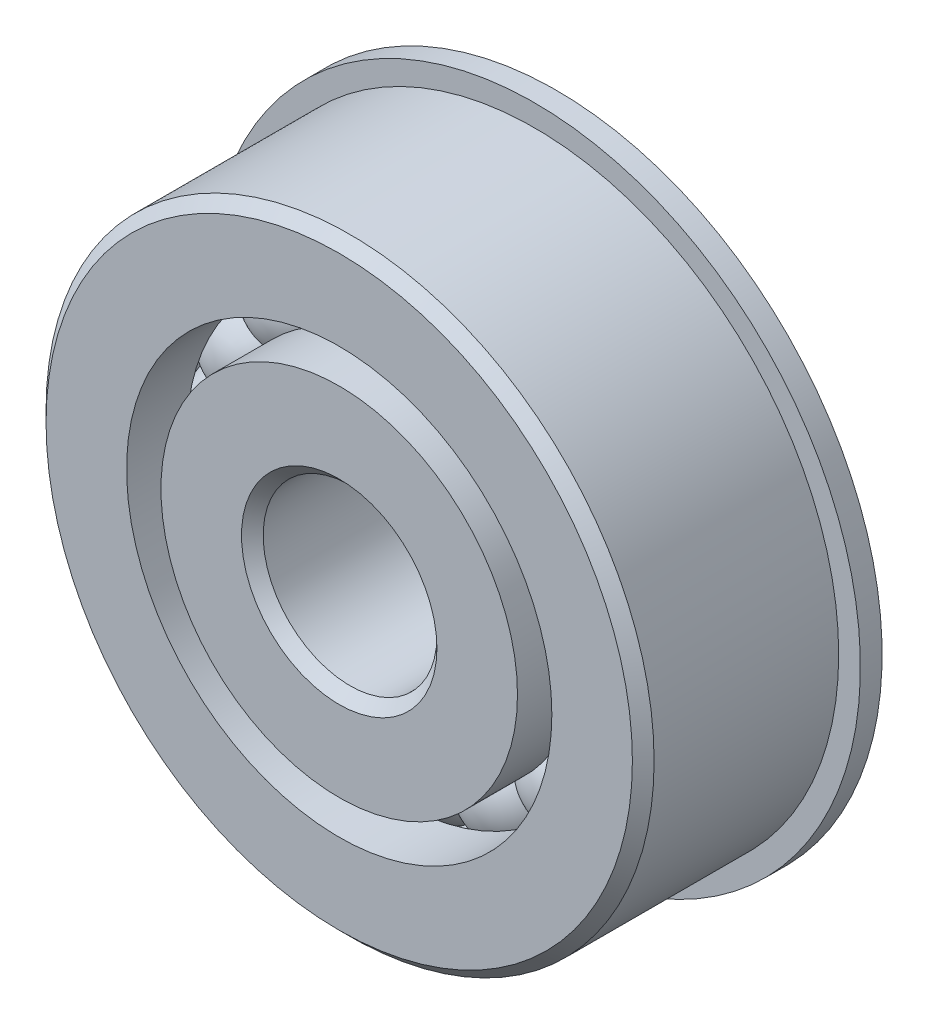
ISO-10303-21;
HEADER;
FILE_DESCRIPTION(('STEP AP214'),'2;1');
FILE_NAME('part.step','',(''),(''),'','','');
FILE_SCHEMA(('AUTOMOTIVE_DESIGN { 1 0 10303 214 1 1 1 1 }'));
ENDSEC;
DATA;
#1=APPLICATION_CONTEXT('core data for automotive mechanical design processes');
#2=APPLICATION_PROTOCOL_DEFINITION('international standard','automotive_design',2000,#1);
#3=PRODUCT_CONTEXT('',#1,'mechanical');
#4=PRODUCT('Part','Part','',(#3));
#5=PRODUCT_RELATED_PRODUCT_CATEGORY('part','',(#4));
#6=PRODUCT_DEFINITION_FORMATION('','',#4);
#7=PRODUCT_DEFINITION_CONTEXT('part definition',#1,'design');
#8=PRODUCT_DEFINITION('design','',#6,#7);
#9=PRODUCT_DEFINITION_SHAPE('','',#8);
#10=(LENGTH_UNIT() NAMED_UNIT(*) SI_UNIT(.MILLI.,.METRE.));
#11=(NAMED_UNIT(*) PLANE_ANGLE_UNIT() SI_UNIT($,.RADIAN.));
#12=(NAMED_UNIT(*) SI_UNIT($,.STERADIAN.) SOLID_ANGLE_UNIT());
#13=UNCERTAINTY_MEASURE_WITH_UNIT(LENGTH_MEASURE(1.E-05),#10,'distance_accuracy_value','');
#14=(GEOMETRIC_REPRESENTATION_CONTEXT(3) GLOBAL_UNCERTAINTY_ASSIGNED_CONTEXT((#13)) GLOBAL_UNIT_ASSIGNED_CONTEXT((#10,
#11,#12)) REPRESENTATION_CONTEXT('',''));
#15=CARTESIAN_POINT('',(0.,0.,0.));
#16=DIRECTION('',(0.,0.,1.));
#17=DIRECTION('',(1.,0.,0.));
#18=AXIS2_PLACEMENT_3D('',#15,#16,#17);
#19=CARTESIAN_POINT('',(-5.46758953991604,13.1999288207551,0.));
#20=DIRECTION('',(0.,0.,1.));
#21=DIRECTION('',(-0.382683432365077,0.923879532511292,0.));
#22=AXIS2_PLACEMENT_3D('',#19,#20,#21);
#23=SPHERICAL_SURFACE('',#22,3.74471126642593);
#24=CARTESIAN_POINT('',(-5.46758953991604,13.1999288207551,3.74471126642593));
#25=VERTEX_POINT('',#24);
#26=VERTEX_LOOP('',#25);
#27=FACE_BOUND('',#26,.T.);
#28=ADVANCED_FACE('F37',(#27),#23,.T.);
#29=CLOSED_SHELL('',(#28));
#30=MANIFOLD_SOLID_BREP('B2',#29);
#31=CARTESIAN_POINT('',(-10.1027881362027,10.1027881362029,0.));
#32=DIRECTION('',(0.,0.,1.));
#33=DIRECTION('',(-0.707106781186539,0.707106781186556,0.));
#34=AXIS2_PLACEMENT_3D('',#31,#32,#33);
#35=SPHERICAL_SURFACE('',#34,3.74471126642593);
#36=CARTESIAN_POINT('',(-10.1027881362027,10.1027881362029,3.74471126642593));
#37=VERTEX_POINT('',#36);
#38=VERTEX_LOOP('',#37);
#39=FACE_BOUND('',#38,.T.);
#40=ADVANCED_FACE('F57',(#39),#35,.T.);
#41=CLOSED_SHELL('',(#40));
#42=MANIFOLD_SOLID_BREP('B6',#41);
#43=CARTESIAN_POINT('',(-13.1999288207549,5.46758953991636,0.));
#44=DIRECTION('',(0.,0.,1.));
#45=DIRECTION('',(-0.923879532511283,0.3826834323651,0.));
#46=AXIS2_PLACEMENT_3D('',#43,#44,#45);
#47=SPHERICAL_SURFACE('',#46,3.74471126642593);
#48=CARTESIAN_POINT('',(-13.1999288207549,5.46758953991636,3.74471126642593));
#49=VERTEX_POINT('',#48);
#50=VERTEX_LOOP('',#49);
#51=FACE_BOUND('',#50,.T.);
#52=ADVANCED_FACE('F77',(#51),#47,.T.);
#53=CLOSED_SHELL('',(#52));
#54=MANIFOLD_SOLID_BREP('B33',#53);
#55=CARTESIAN_POINT('',(-14.2875,1.49653618886164E-13,0.));
#56=DIRECTION('',(0.,0.,1.));
#57=DIRECTION('',(-1.,0.,0.));
#58=AXIS2_PLACEMENT_3D('',#55,#56,#57);
#59=SPHERICAL_SURFACE('',#58,3.74471126642593);
#60=CARTESIAN_POINT('',(-14.2875,1.49653618886164E-13,3.74471126642593));
#61=VERTEX_POINT('',#60);
#62=VERTEX_LOOP('',#61);
#63=FACE_BOUND('',#62,.T.);
#64=ADVANCED_FACE('F97',(#63),#59,.T.);
#65=CLOSED_SHELL('',(#64));
#66=MANIFOLD_SOLID_BREP('B53',#65);
#67=CARTESIAN_POINT('',(-13.1999288207551,-5.46758953991609,0.));
#68=DIRECTION('',(0.,0.,1.));
#69=DIRECTION('',(-0.923879532511291,-0.382683432365081,0.));
#70=AXIS2_PLACEMENT_3D('',#67,#68,#69);
#71=SPHERICAL_SURFACE('',#70,3.74471126642593);
#72=CARTESIAN_POINT('',(-13.1999288207551,-5.46758953991609,3.74471126642593));
#73=VERTEX_POINT('',#72);
#74=VERTEX_LOOP('',#73);
#75=FACE_BOUND('',#74,.T.);
#76=ADVANCED_FACE('F117',(#75),#71,.T.);
#77=CLOSED_SHELL('',(#76));
#78=MANIFOLD_SOLID_BREP('B73',#77);
#79=CARTESIAN_POINT('',(-10.1027881362029,-10.1027881362027,0.));
#80=DIRECTION('',(0.,0.,1.));
#81=DIRECTION('',(-0.707106781186554,-0.707106781186541,0.));
#82=AXIS2_PLACEMENT_3D('',#79,#80,#81);
#83=SPHERICAL_SURFACE('',#82,3.74471126642593);
#84=CARTESIAN_POINT('',(-10.1027881362029,-10.1027881362027,3.74471126642593));
#85=VERTEX_POINT('',#84);
#86=VERTEX_LOOP('',#85);
#87=FACE_BOUND('',#86,.T.);
#88=ADVANCED_FACE('F137',(#87),#83,.T.);
#89=CLOSED_SHELL('',(#88));
#90=MANIFOLD_SOLID_BREP('B93',#89);
#91=CARTESIAN_POINT('',(-5.46758953991632,-13.199928820755,0.));
#92=DIRECTION('',(0.,0.,1.));
#93=DIRECTION('',(-0.382683432365097,-0.923879532511284,0.));
#94=AXIS2_PLACEMENT_3D('',#91,#92,#93);
#95=SPHERICAL_SURFACE('',#94,3.74471126642593);
#96=CARTESIAN_POINT('',(-5.46758953991632,-13.199928820755,3.74471126642593));
#97=VERTEX_POINT('',#96);
#98=VERTEX_LOOP('',#97);
#99=FACE_BOUND('',#98,.T.);
#100=ADVANCED_FACE('F157',(#99),#95,.T.);
#101=CLOSED_SHELL('',(#100));
#102=MANIFOLD_SOLID_BREP('B113',#101);
#103=CARTESIAN_POINT('',(0.,-14.2875,0.));
#104=DIRECTION('',(0.,0.,1.));
#105=DIRECTION('',(0.,-1.,0.));
#106=AXIS2_PLACEMENT_3D('',#103,#104,#105);
#107=SPHERICAL_SURFACE('',#106,3.74471126642593);
#108=CARTESIAN_POINT('',(0.,-14.2875,3.74471126642593));
#109=VERTEX_POINT('',#108);
#110=VERTEX_LOOP('',#109);
#111=FACE_BOUND('',#110,.T.);
#112=ADVANCED_FACE('F177',(#111),#107,.T.);
#113=CLOSED_SHELL('',(#112));
#114=MANIFOLD_SOLID_BREP('B133',#113);
#115=CARTESIAN_POINT('',(5.46758953991614,-13.199928820755,0.));
#116=DIRECTION('',(0.,0.,1.));
#117=DIRECTION('',(0.382683432365084,-0.923879532511289,0.));
#118=AXIS2_PLACEMENT_3D('',#115,#116,#117);
#119=SPHERICAL_SURFACE('',#118,3.74471126642593);
#120=CARTESIAN_POINT('',(5.46758953991614,-13.199928820755,3.74471126642593));
#121=VERTEX_POINT('',#120);
#122=VERTEX_LOOP('',#121);
#123=FACE_BOUND('',#122,.T.);
#124=ADVANCED_FACE('F197',(#123),#119,.T.);
#125=CLOSED_SHELL('',(#124));
#126=MANIFOLD_SOLID_BREP('B153',#125);
#127=CARTESIAN_POINT('',(10.1027881362027,-10.1027881362028,0.));
#128=DIRECTION('',(0.,0.,1.));
#129=DIRECTION('',(0.707106781186544,-0.707106781186551,0.));
#130=AXIS2_PLACEMENT_3D('',#127,#128,#129);
#131=SPHERICAL_SURFACE('',#130,3.74471126642593);
#132=CARTESIAN_POINT('',(10.1027881362027,-10.1027881362028,3.74471126642593));
#133=VERTEX_POINT('',#132);
#134=VERTEX_LOOP('',#133);
#135=FACE_BOUND('',#134,.T.);
#136=ADVANCED_FACE('F217',(#135),#131,.T.);
#137=CLOSED_SHELL('',(#136));
#138=MANIFOLD_SOLID_BREP('B173',#137);
#139=CARTESIAN_POINT('',(13.199928820755,-5.46758953991628,0.));
#140=DIRECTION('',(0.,0.,1.));
#141=DIRECTION('',(0.923879532511285,-0.382683432365094,0.));
#142=AXIS2_PLACEMENT_3D('',#139,#140,#141);
#143=SPHERICAL_SURFACE('',#142,3.74471126642593);
#144=CARTESIAN_POINT('',(13.199928820755,-5.46758953991628,3.74471126642593));
#145=VERTEX_POINT('',#144);
#146=VERTEX_LOOP('',#145);
#147=FACE_BOUND('',#146,.T.);
#148=ADVANCED_FACE('F237',(#147),#143,.T.);
#149=CLOSED_SHELL('',(#148));
#150=MANIFOLD_SOLID_BREP('B193',#149);
#151=CARTESIAN_POINT('',(14.2875,0.,0.));
#152=DIRECTION('',(0.,0.,1.));
#153=DIRECTION('',(1.,0.,0.));
#154=AXIS2_PLACEMENT_3D('',#151,#152,#153);
#155=SPHERICAL_SURFACE('',#154,3.74471126642593);
#156=CARTESIAN_POINT('',(14.2875,0.,3.74471126642593));
#157=VERTEX_POINT('',#156);
#158=VERTEX_LOOP('',#157);
#159=FACE_BOUND('',#158,.T.);
#160=ADVANCED_FACE('F257',(#159),#155,.T.);
#161=CLOSED_SHELL('',(#160));
#162=MANIFOLD_SOLID_BREP('B213',#161);
#163=CARTESIAN_POINT('',(13.199928820755,5.46758953991618,0.));
#164=DIRECTION('',(0.,0.,1.));
#165=DIRECTION('',(0.923879532511288,0.382683432365087,0.));
#166=AXIS2_PLACEMENT_3D('',#163,#164,#165);
#167=SPHERICAL_SURFACE('',#166,3.74471126642593);
#168=CARTESIAN_POINT('',(13.199928820755,5.46758953991618,3.74471126642593));
#169=VERTEX_POINT('',#168);
#170=VERTEX_LOOP('',#169);
#171=FACE_BOUND('',#170,.T.);
#172=ADVANCED_FACE('F277',(#171),#167,.T.);
#173=CLOSED_SHELL('',(#172));
#174=MANIFOLD_SOLID_BREP('B233',#173);
#175=CARTESIAN_POINT('',(10.1027881362028,10.1027881362028,0.));
#176=DIRECTION('',(0.,0.,1.));
#177=DIRECTION('',(0.707106781186549,0.707106781186546,0.));
#178=AXIS2_PLACEMENT_3D('',#175,#176,#177);
#179=SPHERICAL_SURFACE('',#178,3.74471126642593);
#180=CARTESIAN_POINT('',(10.1027881362028,10.1027881362028,3.74471126642593));
#181=VERTEX_POINT('',#180);
#182=VERTEX_LOOP('',#181);
#183=FACE_BOUND('',#182,.T.);
#184=ADVANCED_FACE('F297',(#183),#179,.T.);
#185=CLOSED_SHELL('',(#184));
#186=MANIFOLD_SOLID_BREP('B253',#185);
#187=CARTESIAN_POINT('',(5.46758953991623,13.199928820755,0.));
#188=DIRECTION('',(0.,0.,1.));
#189=DIRECTION('',(0.382683432365091,0.923879532511287,0.));
#190=AXIS2_PLACEMENT_3D('',#187,#188,#189);
#191=SPHERICAL_SURFACE('',#190,3.74471126642593);
#192=CARTESIAN_POINT('',(5.46758953991623,13.199928820755,3.74471126642593));
#193=VERTEX_POINT('',#192);
#194=VERTEX_LOOP('',#193);
#195=FACE_BOUND('',#194,.T.);
#196=ADVANCED_FACE('F317',(#195),#191,.T.);
#197=CLOSED_SHELL('',(#196));
#198=MANIFOLD_SOLID_BREP('B273',#197);
#199=CARTESIAN_POINT('',(0.,14.2875,0.));
#200=DIRECTION('',(0.,0.,1.));
#201=DIRECTION('',(0.,1.,0.));
#202=AXIS2_PLACEMENT_3D('',#199,#200,#201);
#203=SPHERICAL_SURFACE('',#202,3.74471126642593);
#204=CARTESIAN_POINT('',(0.,14.2875,3.74471126642593));
#205=VERTEX_POINT('',#204);
#206=VERTEX_LOOP('',#205);
#207=FACE_BOUND('',#206,.T.);
#208=ADVANCED_FACE('F339',(#207),#203,.T.);
#209=CLOSED_SHELL('',(#208));
#210=MANIFOLD_SOLID_BREP('B293',#209);
#211=CARTESIAN_POINT('',(0.,13.031456043956,7.9375));
#212=DIRECTION('',(0.,0.,-1.));
#213=DIRECTION('',(-1.,0.,0.));
#214=AXIS2_PLACEMENT_3D('',#211,#212,#213);
#215=PLANE('',#214);
#216=CARTESIAN_POINT('',(0.,0.,7.9375));
#217=DIRECTION('',(0.,0.,1.));
#218=DIRECTION('',(1.,0.,0.));
#219=AXIS2_PLACEMENT_3D('',#216,#217,#218);
#220=CIRCLE('',#219,7.14375);
#221=CARTESIAN_POINT('',(7.14375,0.,7.9375));
#222=VERTEX_POINT('',#221);
#223=EDGE_CURVE('E386',#222,#222,#220,.T.);
#224=ORIENTED_EDGE('',*,*,#223,.F.);
#225=EDGE_LOOP('',(#224));
#226=FACE_BOUND('',#225,.T.);
#227=CARTESIAN_POINT('',(0.,0.,7.9375));
#228=DIRECTION('',(0.,0.,1.));
#229=DIRECTION('',(1.,0.,0.));
#230=AXIS2_PLACEMENT_3D('',#227,#228,#229);
#231=CIRCLE('',#230,13.031456043956);
#232=CARTESIAN_POINT('',(13.031456043956,0.,7.9375));
#233=VERTEX_POINT('',#232);
#234=EDGE_CURVE('E338',#233,#233,#231,.T.);
#235=ORIENTED_EDGE('',*,*,#234,.T.);
#236=EDGE_LOOP('',(#235));
#237=FACE_BOUND('',#236,.T.);
#238=ADVANCED_FACE('F358',(#226,#237),#215,.F.);
#239=CARTESIAN_POINT('',(0.,0.,7.9375));
#240=DIRECTION('',(0.,0.,1.));
#241=DIRECTION('',(1.,0.,0.));
#242=AXIS2_PLACEMENT_3D('',#239,#240,#241);
#243=CYLINDRICAL_SURFACE('',#242,13.031456043956);
#244=ORIENTED_EDGE('',*,*,#234,.F.);
#245=EDGE_LOOP('',(#244));
#246=FACE_BOUND('',#245,.T.);
#247=CARTESIAN_POINT('',(0.,0.,3.52777777777778));
#248=DIRECTION('',(0.,0.,1.));
#249=DIRECTION('',(1.,0.,0.));
#250=AXIS2_PLACEMENT_3D('',#247,#248,#249);
#251=CIRCLE('',#250,13.031456043956);
#252=CARTESIAN_POINT('',(13.031456043956,0.,3.52777777777778));
#253=VERTEX_POINT('',#252);
#254=EDGE_CURVE('E364',#253,#253,#251,.T.);
#255=ORIENTED_EDGE('',*,*,#254,.T.);
#256=EDGE_LOOP('',(#255));
#257=FACE_BOUND('',#256,.T.);
#258=ADVANCED_FACE('F393',(#246,#257),#243,.T.);
#259=CARTESIAN_POINT('',(0.,0.,0.));
#260=DIRECTION('',(0.,0.,1.));
#261=DIRECTION('',(1.,0.,0.));
#262=AXIS2_PLACEMENT_3D('',#259,#260,#261);
#263=TOROIDAL_SURFACE('',#262,14.2875,3.74471126642592);
#264=ORIENTED_EDGE('',*,*,#254,.F.);
#265=EDGE_LOOP('',(#264));
#266=FACE_BOUND('',#265,.T.);
#267=CARTESIAN_POINT('',(0.,0.,-3.52777777777778));
#268=DIRECTION('',(0.,0.,1.));
#269=DIRECTION('',(1.,0.,0.));
#270=AXIS2_PLACEMENT_3D('',#267,#268,#269);
#271=CIRCLE('',#270,13.031456043956);
#272=CARTESIAN_POINT('',(13.031456043956,0.,-3.52777777777778));
#273=VERTEX_POINT('',#272);
#274=EDGE_CURVE('E368',#273,#273,#271,.T.);
#275=ORIENTED_EDGE('',*,*,#274,.T.);
#276=EDGE_LOOP('',(#275));
#277=FACE_BOUND('',#276,.T.);
#278=ADVANCED_FACE('F397',(#266,#277),#263,.F.);
#279=CARTESIAN_POINT('',(0.,0.,7.9375));
#280=DIRECTION('',(0.,0.,1.));
#281=DIRECTION('',(1.,0.,0.));
#282=AXIS2_PLACEMENT_3D('',#279,#280,#281);
#283=CYLINDRICAL_SURFACE('',#282,13.031456043956);
#284=ORIENTED_EDGE('',*,*,#274,.F.);
#285=EDGE_LOOP('',(#284));
#286=FACE_BOUND('',#285,.T.);
#287=CARTESIAN_POINT('',(0.,0.,-7.9375));
#288=DIRECTION('',(0.,0.,1.));
#289=DIRECTION('',(1.,0.,0.));
#290=AXIS2_PLACEMENT_3D('',#287,#288,#289);
#291=CIRCLE('',#290,13.031456043956);
#292=CARTESIAN_POINT('',(13.031456043956,0.,-7.9375));
#293=VERTEX_POINT('',#292);
#294=EDGE_CURVE('E372',#293,#293,#291,.T.);
#295=ORIENTED_EDGE('',*,*,#294,.T.);
#296=EDGE_LOOP('',(#295));
#297=FACE_BOUND('',#296,.T.);
#298=ADVANCED_FACE('F402',(#286,#297),#283,.T.);
#299=CARTESIAN_POINT('',(0.,7.14375,-7.9375));
#300=DIRECTION('',(0.,0.,1.));
#301=DIRECTION('',(1.,0.,0.));
#302=AXIS2_PLACEMENT_3D('',#299,#300,#301);
#303=PLANE('',#302);
#304=ORIENTED_EDGE('',*,*,#294,.F.);
#305=EDGE_LOOP('',(#304));
#306=FACE_BOUND('',#305,.T.);
#307=CARTESIAN_POINT('',(0.,0.,-7.9375));
#308=DIRECTION('',(0.,0.,1.));
#309=DIRECTION('',(1.,0.,0.));
#310=AXIS2_PLACEMENT_3D('',#307,#308,#309);
#311=CIRCLE('',#310,7.14375);
#312=CARTESIAN_POINT('',(7.14375,0.,-7.9375));
#313=VERTEX_POINT('',#312);
#314=EDGE_CURVE('E377',#313,#313,#311,.T.);
#315=ORIENTED_EDGE('',*,*,#314,.T.);
#316=EDGE_LOOP('',(#315));
#317=FACE_BOUND('',#316,.T.);
#318=ADVANCED_FACE('F408',(#306,#317),#303,.F.);
#319=CARTESIAN_POINT('',(0.,0.,-7.14375));
#320=DIRECTION('',(0.,0.,-1.));
#321=DIRECTION('',(-1.,0.,0.));
#322=AXIS2_PLACEMENT_3D('',#319,#320,#321);
#323=CONICAL_SURFACE('',#322,6.35,0.785398163397447);
#324=ORIENTED_EDGE('',*,*,#314,.F.);
#325=EDGE_LOOP('',(#324));
#326=FACE_BOUND('',#325,.T.);
#327=CARTESIAN_POINT('',(0.,0.,-7.14375));
#328=DIRECTION('',(0.,0.,1.));
#329=DIRECTION('',(1.,0.,0.));
#330=AXIS2_PLACEMENT_3D('',#327,#328,#329);
#331=CIRCLE('',#330,6.35);
#332=CARTESIAN_POINT('',(6.35,0.,-7.14375));
#333=VERTEX_POINT('',#332);
#334=EDGE_CURVE('E380',#333,#333,#331,.T.);
#335=ORIENTED_EDGE('',*,*,#334,.T.);
#336=EDGE_LOOP('',(#335));
#337=FACE_BOUND('',#336,.T.);
#338=ADVANCED_FACE('F412',(#326,#337),#323,.F.);
#339=CARTESIAN_POINT('',(0.,0.,7.9375));
#340=DIRECTION('',(0.,0.,1.));
#341=DIRECTION('',(1.,0.,0.));
#342=AXIS2_PLACEMENT_3D('',#339,#340,#341);
#343=CYLINDRICAL_SURFACE('',#342,6.35);
#344=ORIENTED_EDGE('',*,*,#334,.F.);
#345=EDGE_LOOP('',(#344));
#346=FACE_BOUND('',#345,.T.);
#347=CARTESIAN_POINT('',(0.,0.,7.14375));
#348=DIRECTION('',(0.,0.,1.));
#349=DIRECTION('',(1.,0.,0.));
#350=AXIS2_PLACEMENT_3D('',#347,#348,#349);
#351=CIRCLE('',#350,6.35);
#352=CARTESIAN_POINT('',(6.35,0.,7.14375));
#353=VERTEX_POINT('',#352);
#354=EDGE_CURVE('E383',#353,#353,#351,.T.);
#355=ORIENTED_EDGE('',*,*,#354,.T.);
#356=EDGE_LOOP('',(#355));
#357=FACE_BOUND('',#356,.T.);
#358=ADVANCED_FACE('F416',(#346,#357),#343,.F.);
#359=CARTESIAN_POINT('',(0.,0.,7.9375));
#360=DIRECTION('',(0.,0.,1.));
#361=DIRECTION('',(1.,0.,0.));
#362=AXIS2_PLACEMENT_3D('',#359,#360,#361);
#363=CONICAL_SURFACE('',#362,7.14375,0.785398163397449);
#364=ORIENTED_EDGE('',*,*,#354,.F.);
#365=EDGE_LOOP('',(#364));
#366=FACE_BOUND('',#365,.T.);
#367=ORIENTED_EDGE('',*,*,#223,.T.);
#368=EDGE_LOOP('',(#367));
#369=FACE_BOUND('',#368,.T.);
#370=ADVANCED_FACE('F390',(#366,#369),#363,.F.);
#371=CLOSED_SHELL('',(#238,#258,#278,#298,#318,#338,#358,#370));
#372=MANIFOLD_SOLID_BREP('B313',#371);
#373=CARTESIAN_POINT('',(0.,0.,7.14375));
#374=DIRECTION('',(0.,0.,-1.));
#375=DIRECTION('',(-1.,0.,0.));
#376=AXIS2_PLACEMENT_3D('',#373,#374,#375);
#377=CONICAL_SURFACE('',#376,22.225,0.785398163397446);
#378=CARTESIAN_POINT('',(0.,0.,7.9375));
#379=DIRECTION('',(0.,0.,1.));
#380=DIRECTION('',(1.,0.,0.));
#381=AXIS2_PLACEMENT_3D('',#378,#379,#380);
#382=CIRCLE('',#381,21.43125);
#383=CARTESIAN_POINT('',(21.43125,0.,7.9375));
#384=VERTEX_POINT('',#383);
#385=EDGE_CURVE('E501',#384,#384,#382,.T.);
#386=ORIENTED_EDGE('',*,*,#385,.F.);
#387=EDGE_LOOP('',(#386));
#388=FACE_BOUND('',#387,.T.);
#389=CARTESIAN_POINT('',(0.,0.,7.14375));
#390=DIRECTION('',(0.,0.,1.));
#391=DIRECTION('',(1.,0.,0.));
#392=AXIS2_PLACEMENT_3D('',#389,#390,#391);
#393=CIRCLE('',#392,22.225);
#394=CARTESIAN_POINT('',(22.225,0.,7.14375));
#395=VERTEX_POINT('',#394);
#396=EDGE_CURVE('E357',#395,#395,#393,.T.);
#397=ORIENTED_EDGE('',*,*,#396,.T.);
#398=EDGE_LOOP('',(#397));
#399=FACE_BOUND('',#398,.T.);
#400=ADVANCED_FACE('F479',(#388,#399),#377,.T.);
#401=CARTESIAN_POINT('',(0.,0.,7.9375));
#402=DIRECTION('',(0.,0.,1.));
#403=DIRECTION('',(1.,0.,0.));
#404=AXIS2_PLACEMENT_3D('',#401,#402,#403);
#405=CYLINDRICAL_SURFACE('',#404,22.225);
#406=CARTESIAN_POINT('',(0.,0.,-6.35));
#407=DIRECTION('',(0.,0.,1.));
#408=DIRECTION('',(1.,0.,0.));
#409=AXIS2_PLACEMENT_3D('',#406,#407,#408);
#410=CIRCLE('',#409,22.225);
#411=CARTESIAN_POINT('',(22.225,0.,-6.35));
#412=VERTEX_POINT('',#411);
#413=EDGE_CURVE('E504',#412,#412,#410,.T.);
#414=ORIENTED_EDGE('',*,*,#413,.T.);
#415=EDGE_LOOP('',(#414));
#416=FACE_BOUND('',#415,.T.);
#417=ORIENTED_EDGE('',*,*,#396,.F.);
#418=EDGE_LOOP('',(#417));
#419=FACE_BOUND('',#418,.T.);
#420=ADVANCED_FACE('F524',(#416,#419),#405,.T.);
#421=CARTESIAN_POINT('',(0.,21.43125,-7.9375));
#422=DIRECTION('',(0.,0.,1.));
#423=DIRECTION('',(1.,0.,0.));
#424=AXIS2_PLACEMENT_3D('',#421,#422,#423);
#425=PLANE('',#424);
#426=CARTESIAN_POINT('',(0.,0.,-7.9375));
#427=DIRECTION('',(0.,0.,1.));
#428=DIRECTION('',(1.,0.,0.));
#429=AXIS2_PLACEMENT_3D('',#426,#427,#428);
#430=CIRCLE('',#429,15.543543956044);
#431=CARTESIAN_POINT('',(15.543543956044,0.,-7.9375));
#432=VERTEX_POINT('',#431);
#433=EDGE_CURVE('E485',#432,#432,#430,.T.);
#434=ORIENTED_EDGE('',*,*,#433,.T.);
#435=EDGE_LOOP('',(#434));
#436=FACE_BOUND('',#435,.T.);
#437=CARTESIAN_POINT('',(0.,0.,-7.9375));
#438=DIRECTION('',(0.,0.,-1.));
#439=DIRECTION('',(-1.,0.,0.));
#440=AXIS2_PLACEMENT_3D('',#437,#438,#439);
#441=CIRCLE('',#440,23.8125);
#442=CARTESIAN_POINT('',(-23.8125,0.,-7.9375));
#443=VERTEX_POINT('',#442);
#444=EDGE_CURVE('E507',#443,#443,#441,.T.);
#445=ORIENTED_EDGE('',*,*,#444,.T.);
#446=EDGE_LOOP('',(#445));
#447=FACE_BOUND('',#446,.T.);
#448=ADVANCED_FACE('F527',(#436,#447),#425,.F.);
#449=CARTESIAN_POINT('',(0.,0.,7.9375));
#450=DIRECTION('',(0.,0.,1.));
#451=DIRECTION('',(1.,0.,0.));
#452=AXIS2_PLACEMENT_3D('',#449,#450,#451);
#453=CYLINDRICAL_SURFACE('',#452,15.543543956044);
#454=CARTESIAN_POINT('',(0.,0.,-3.52777777777778));
#455=DIRECTION('',(0.,0.,1.));
#456=DIRECTION('',(1.,0.,0.));
#457=AXIS2_PLACEMENT_3D('',#454,#455,#456);
#458=CIRCLE('',#457,15.543543956044);
#459=CARTESIAN_POINT('',(15.543543956044,0.,-3.52777777777778));
#460=VERTEX_POINT('',#459);
#461=EDGE_CURVE('E489',#460,#460,#458,.T.);
#462=ORIENTED_EDGE('',*,*,#461,.T.);
#463=EDGE_LOOP('',(#462));
#464=FACE_BOUND('',#463,.T.);
#465=ORIENTED_EDGE('',*,*,#433,.F.);
#466=EDGE_LOOP('',(#465));
#467=FACE_BOUND('',#466,.T.);
#468=ADVANCED_FACE('F532',(#464,#467),#453,.F.);
#469=CARTESIAN_POINT('',(0.,0.,0.));
#470=DIRECTION('',(0.,0.,1.));
#471=DIRECTION('',(1.,0.,0.));
#472=AXIS2_PLACEMENT_3D('',#469,#470,#471);
#473=TOROIDAL_SURFACE('',#472,14.2875,3.74471126642593);
#474=ORIENTED_EDGE('',*,*,#461,.F.);
#475=EDGE_LOOP('',(#474));
#476=FACE_BOUND('',#475,.T.);
#477=CARTESIAN_POINT('',(0.,0.,3.52777777777778));
#478=DIRECTION('',(0.,0.,1.));
#479=DIRECTION('',(1.,0.,0.));
#480=AXIS2_PLACEMENT_3D('',#477,#478,#479);
#481=CIRCLE('',#480,15.543543956044);
#482=CARTESIAN_POINT('',(15.543543956044,0.,3.52777777777778));
#483=VERTEX_POINT('',#482);
#484=EDGE_CURVE('E493',#483,#483,#481,.T.);
#485=ORIENTED_EDGE('',*,*,#484,.T.);
#486=EDGE_LOOP('',(#485));
#487=FACE_BOUND('',#486,.T.);
#488=ADVANCED_FACE('F538',(#476,#487),#473,.F.);
#489=CARTESIAN_POINT('',(0.,0.,7.9375));
#490=DIRECTION('',(0.,0.,1.));
#491=DIRECTION('',(1.,0.,0.));
#492=AXIS2_PLACEMENT_3D('',#489,#490,#491);
#493=CYLINDRICAL_SURFACE('',#492,15.543543956044);
#494=ORIENTED_EDGE('',*,*,#484,.F.);
#495=EDGE_LOOP('',(#494));
#496=FACE_BOUND('',#495,.T.);
#497=CARTESIAN_POINT('',(0.,0.,7.9375));
#498=DIRECTION('',(0.,0.,1.));
#499=DIRECTION('',(1.,0.,0.));
#500=AXIS2_PLACEMENT_3D('',#497,#498,#499);
#501=CIRCLE('',#500,15.543543956044);
#502=CARTESIAN_POINT('',(15.543543956044,0.,7.9375));
#503=VERTEX_POINT('',#502);
#504=EDGE_CURVE('E498',#503,#503,#501,.T.);
#505=ORIENTED_EDGE('',*,*,#504,.T.);
#506=EDGE_LOOP('',(#505));
#507=FACE_BOUND('',#506,.T.);
#508=ADVANCED_FACE('F542',(#496,#507),#493,.F.);
#509=CARTESIAN_POINT('',(0.,21.43125,7.9375));
#510=DIRECTION('',(0.,0.,-1.));
#511=DIRECTION('',(-1.,0.,0.));
#512=AXIS2_PLACEMENT_3D('',#509,#510,#511);
#513=PLANE('',#512);
#514=ORIENTED_EDGE('',*,*,#504,.F.);
#515=EDGE_LOOP('',(#514));
#516=FACE_BOUND('',#515,.T.);
#517=ORIENTED_EDGE('',*,*,#385,.T.);
#518=EDGE_LOOP('',(#517));
#519=FACE_BOUND('',#518,.T.);
#520=ADVANCED_FACE('F520',(#516,#519),#513,.F.);
#521=CARTESIAN_POINT('',(0.,15.543543956044,-6.35));
#522=DIRECTION('',(0.,0.,1.));
#523=DIRECTION('',(1.,0.,0.));
#524=AXIS2_PLACEMENT_3D('',#521,#522,#523);
#525=PLANE('',#524);
#526=CARTESIAN_POINT('',(0.,0.,-6.35));
#527=DIRECTION('',(0.,0.,-1.));
#528=DIRECTION('',(-1.,0.,0.));
#529=AXIS2_PLACEMENT_3D('',#526,#527,#528);
#530=CIRCLE('',#529,23.8125);
#531=CARTESIAN_POINT('',(-23.8125,0.,-6.35));
#532=VERTEX_POINT('',#531);
#533=EDGE_CURVE('E510',#532,#532,#530,.T.);
#534=ORIENTED_EDGE('',*,*,#533,.F.);
#535=EDGE_LOOP('',(#534));
#536=FACE_BOUND('',#535,.T.);
#537=ORIENTED_EDGE('',*,*,#413,.F.);
#538=EDGE_LOOP('',(#537));
#539=FACE_BOUND('',#538,.T.);
#540=ADVANCED_FACE('F517',(#536,#539),#525,.T.);
#541=CARTESIAN_POINT('',(0.,0.,-7.9375));
#542=DIRECTION('',(0.,0.,-1.));
#543=DIRECTION('',(-1.,0.,0.));
#544=AXIS2_PLACEMENT_3D('',#541,#542,#543);
#545=CYLINDRICAL_SURFACE('',#544,23.8125);
#546=ORIENTED_EDGE('',*,*,#533,.T.);
#547=EDGE_LOOP('',(#546));
#548=FACE_BOUND('',#547,.T.);
#549=ORIENTED_EDGE('',*,*,#444,.F.);
#550=EDGE_LOOP('',(#549));
#551=FACE_BOUND('',#550,.T.);
#552=ADVANCED_FACE('F514',(#548,#551),#545,.T.);
#553=CLOSED_SHELL('',(#400,#420,#448,#468,#488,#508,#520,#540,#552));
#554=MANIFOLD_SOLID_BREP('B333',#553);
#555=ADVANCED_BREP_SHAPE_REPRESENTATION('',(#18,#30,#42,#54,#66,#78,#90,#102,#114,#126,#138,
#150,#162,#174,#186,#198,#210,#372,#554),#14);
#556=SHAPE_DEFINITION_REPRESENTATION(#9,#555);
ENDSEC;
END-ISO-10303-21;
